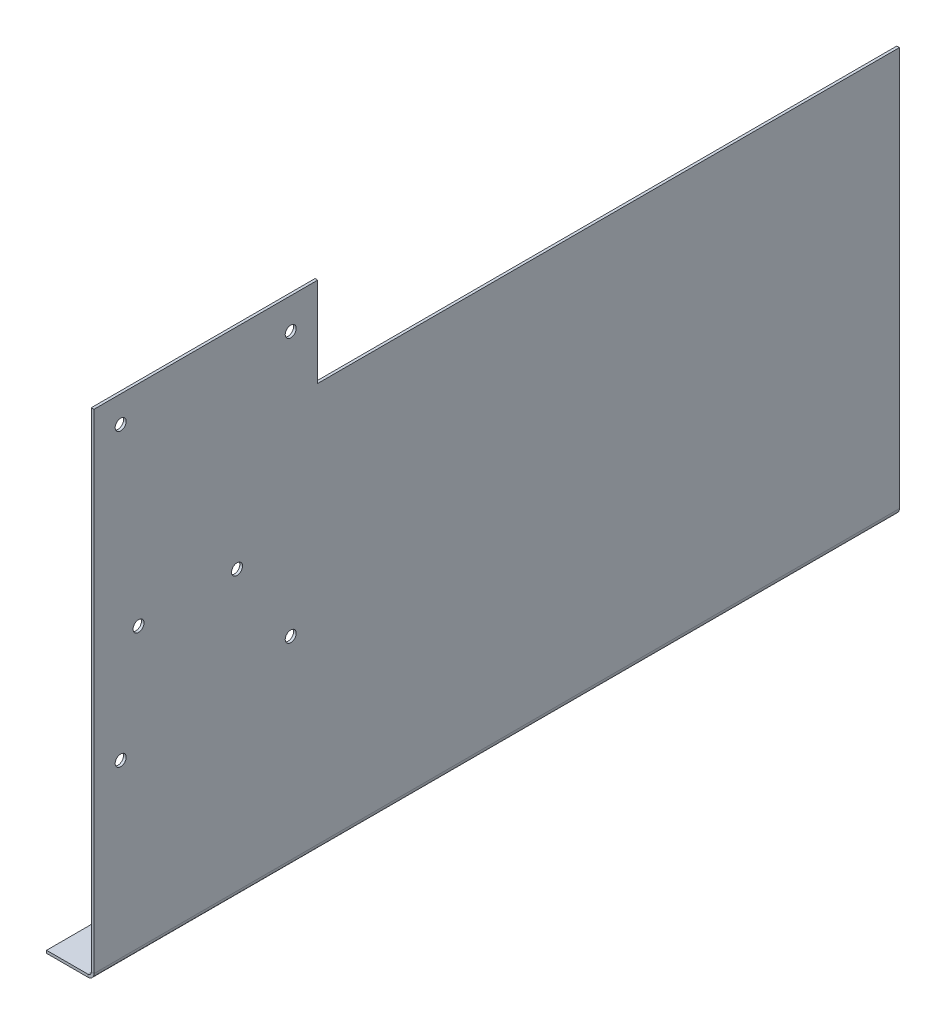
ISO-10303-21;
HEADER;
FILE_DESCRIPTION(('STEP AP214'),'2;1');
FILE_NAME('part.step','',(''),(''),'','','');
FILE_SCHEMA(('AUTOMOTIVE_DESIGN { 1 0 10303 214 1 1 1 1 }'));
ENDSEC;
DATA;
#1=APPLICATION_CONTEXT('core data for automotive mechanical design processes');
#2=APPLICATION_PROTOCOL_DEFINITION('international standard','automotive_design',2000,#1);
#3=PRODUCT_CONTEXT('',#1,'mechanical');
#4=PRODUCT('Part','Part','',(#3));
#5=PRODUCT_RELATED_PRODUCT_CATEGORY('part','',(#4));
#6=PRODUCT_DEFINITION_FORMATION('','',#4);
#7=PRODUCT_DEFINITION_CONTEXT('part definition',#1,'design');
#8=PRODUCT_DEFINITION('design','',#6,#7);
#9=PRODUCT_DEFINITION_SHAPE('','',#8);
#10=(LENGTH_UNIT() NAMED_UNIT(*) SI_UNIT(.MILLI.,.METRE.));
#11=(NAMED_UNIT(*) PLANE_ANGLE_UNIT() SI_UNIT($,.RADIAN.));
#12=(NAMED_UNIT(*) SI_UNIT($,.STERADIAN.) SOLID_ANGLE_UNIT());
#13=UNCERTAINTY_MEASURE_WITH_UNIT(LENGTH_MEASURE(1.E-05),#10,'distance_accuracy_value','');
#14=(GEOMETRIC_REPRESENTATION_CONTEXT(3) GLOBAL_UNCERTAINTY_ASSIGNED_CONTEXT((#13)) GLOBAL_UNIT_ASSIGNED_CONTEXT((#10,
#11,#12)) REPRESENTATION_CONTEXT('',''));
#15=CARTESIAN_POINT('',(0.,0.,0.));
#16=DIRECTION('',(0.,0.,1.));
#17=DIRECTION('',(1.,0.,0.));
#18=AXIS2_PLACEMENT_3D('',#15,#16,#17);
#19=CARTESIAN_POINT('',(12.7,1.,228.6));
#20=DIRECTION('',(0.,0.,1.));
#21=DIRECTION('',(1.,0.,0.));
#22=AXIS2_PLACEMENT_3D('',#19,#20,#21);
#23=PLANE('',#22);
#24=DIRECTION('',(1.,0.,0.));
#25=VECTOR('',#24,1.);
#26=CARTESIAN_POINT('',(12.7,1.,228.6));
#27=LINE('',#26,#25);
#28=CARTESIAN_POINT('',(12.7,1.,228.6));
#29=VERTEX_POINT('',#28);
#30=CARTESIAN_POINT('',(13.45946,1.,228.6));
#31=VERTEX_POINT('',#30);
#32=EDGE_CURVE('E11',#29,#31,#27,.T.);
#33=ORIENTED_EDGE('',*,*,#32,.F.);
#34=CARTESIAN_POINT('',(11.7,1.,228.6));
#35=DIRECTION('',(0.,0.,-1.));
#36=DIRECTION('',(-1.,0.,0.));
#37=AXIS2_PLACEMENT_3D('',#34,#35,#36);
#38=CIRCLE('',#37,1.);
#39=CARTESIAN_POINT('',(11.7,0.,228.6));
#40=VERTEX_POINT('',#39);
#41=EDGE_CURVE('E136',#40,#29,#38,.F.);
#42=ORIENTED_EDGE('',*,*,#41,.F.);
#43=DIRECTION('',(0.,1.,0.));
#44=VECTOR('',#43,1.);
#45=CARTESIAN_POINT('',(11.7,-0.75946,228.6));
#46=LINE('',#45,#44);
#47=CARTESIAN_POINT('',(11.7,-0.75946,228.6));
#48=VERTEX_POINT('',#47);
#49=EDGE_CURVE('E42',#48,#40,#46,.T.);
#50=ORIENTED_EDGE('',*,*,#49,.F.);
#51=CARTESIAN_POINT('',(11.7,1.,228.6));
#52=DIRECTION('',(0.,0.,1.));
#53=DIRECTION('',(1.,0.,0.));
#54=AXIS2_PLACEMENT_3D('',#51,#52,#53);
#55=CIRCLE('',#54,1.75946);
#56=EDGE_CURVE('E129',#48,#31,#55,.T.);
#57=ORIENTED_EDGE('',*,*,#56,.T.);
#58=EDGE_LOOP('',(#33,#42,#50,#57));
#59=FACE_BOUND('',#58,.T.);
#60=ADVANCED_FACE('F34',(#59),#23,.T.);
#61=CARTESIAN_POINT('',(11.7,-0.75946,228.6));
#62=DIRECTION('',(0.,0.,1.));
#63=DIRECTION('',(1.,0.,0.));
#64=AXIS2_PLACEMENT_3D('',#61,#62,#63);
#65=PLANE('',#64);
#66=DIRECTION('',(0.,1.,0.));
#67=VECTOR('',#66,1.);
#68=CARTESIAN_POINT('',(12.7,0.,228.6));
#69=LINE('',#68,#67);
#70=CARTESIAN_POINT('',(12.7,139.7,228.6));
#71=VERTEX_POINT('',#70);
#72=EDGE_CURVE('E247',#29,#71,#69,.T.);
#73=ORIENTED_EDGE('',*,*,#72,.F.);
#74=ORIENTED_EDGE('',*,*,#32,.T.);
#75=DIRECTION('',(0.,1.,0.));
#76=VECTOR('',#75,1.);
#77=CARTESIAN_POINT('',(13.45946,0.,228.6));
#78=LINE('',#77,#76);
#79=CARTESIAN_POINT('',(13.45946,139.7,228.6));
#80=VERTEX_POINT('',#79);
#81=EDGE_CURVE('E91',#31,#80,#78,.T.);
#82=ORIENTED_EDGE('',*,*,#81,.T.);
#83=DIRECTION('',(1.,0.,0.));
#84=VECTOR('',#83,1.);
#85=CARTESIAN_POINT('',(12.7,139.7,228.6));
#86=LINE('',#85,#84);
#87=EDGE_CURVE('E244',#71,#80,#86,.T.);
#88=ORIENTED_EDGE('',*,*,#87,.F.);
#89=EDGE_LOOP('',(#73,#74,#82,#88));
#90=FACE_BOUND('',#89,.T.);
#91=ADVANCED_FACE('F268',(#90),#65,.T.);
#92=CARTESIAN_POINT('',(11.7,0.,0.));
#93=DIRECTION('',(0.,0.,-1.));
#94=DIRECTION('',(-1.,0.,0.));
#95=AXIS2_PLACEMENT_3D('',#92,#93,#94);
#96=PLANE('',#95);
#97=DIRECTION('',(0.,-1.,0.));
#98=VECTOR('',#97,1.);
#99=CARTESIAN_POINT('',(11.7,0.,0.));
#100=LINE('',#99,#98);
#101=CARTESIAN_POINT('',(11.7,0.,0.));
#102=VERTEX_POINT('',#101);
#103=CARTESIAN_POINT('',(11.7,-0.75946,0.));
#104=VERTEX_POINT('',#103);
#105=EDGE_CURVE('E176',#102,#104,#100,.T.);
#106=ORIENTED_EDGE('',*,*,#105,.F.);
#107=CARTESIAN_POINT('',(11.7,1.,0.));
#108=DIRECTION('',(0.,0.,-1.));
#109=DIRECTION('',(-1.,0.,0.));
#110=AXIS2_PLACEMENT_3D('',#107,#108,#109);
#111=CIRCLE('',#110,1.);
#112=CARTESIAN_POINT('',(12.7,1.,0.));
#113=VERTEX_POINT('',#112);
#114=EDGE_CURVE('E149',#102,#113,#111,.F.);
#115=ORIENTED_EDGE('',*,*,#114,.T.);
#116=DIRECTION('',(-1.,0.,0.));
#117=VECTOR('',#116,1.);
#118=CARTESIAN_POINT('',(13.45946,1.,0.));
#119=LINE('',#118,#117);
#120=CARTESIAN_POINT('',(13.45946,1.,0.));
#121=VERTEX_POINT('',#120);
#122=EDGE_CURVE('E85',#121,#113,#119,.T.);
#123=ORIENTED_EDGE('',*,*,#122,.F.);
#124=CARTESIAN_POINT('',(11.7,1.,0.));
#125=DIRECTION('',(0.,0.,1.));
#126=DIRECTION('',(1.,0.,0.));
#127=AXIS2_PLACEMENT_3D('',#124,#125,#126);
#128=CIRCLE('',#127,1.75946);
#129=EDGE_CURVE('E157',#104,#121,#128,.T.);
#130=ORIENTED_EDGE('',*,*,#129,.F.);
#131=EDGE_LOOP('',(#106,#115,#123,#130));
#132=FACE_BOUND('',#131,.T.);
#133=ADVANCED_FACE('F266',(#132),#96,.T.);
#134=CARTESIAN_POINT('',(13.45946,1.,0.));
#135=DIRECTION('',(0.,0.,-1.));
#136=DIRECTION('',(-1.,0.,0.));
#137=AXIS2_PLACEMENT_3D('',#134,#135,#136);
#138=PLANE('',#137);
#139=DIRECTION('',(1.,0.,0.));
#140=VECTOR('',#139,1.);
#141=CARTESIAN_POINT('',(0.,0.,0.));
#142=LINE('',#141,#140);
#143=CARTESIAN_POINT('',(0.,0.,0.));
#144=VERTEX_POINT('',#143);
#145=EDGE_CURVE('E151',#144,#102,#142,.T.);
#146=ORIENTED_EDGE('',*,*,#145,.T.);
#147=ORIENTED_EDGE('',*,*,#105,.T.);
#148=DIRECTION('',(1.,0.,0.));
#149=VECTOR('',#148,1.);
#150=CARTESIAN_POINT('',(0.,-0.75946,0.));
#151=LINE('',#150,#149);
#152=CARTESIAN_POINT('',(0.,-0.75946,0.));
#153=VERTEX_POINT('',#152);
#154=EDGE_CURVE('E155',#153,#104,#151,.T.);
#155=ORIENTED_EDGE('',*,*,#154,.F.);
#156=DIRECTION('',(0.,1.,0.));
#157=VECTOR('',#156,1.);
#158=CARTESIAN_POINT('',(0.,-0.75946,0.));
#159=LINE('',#158,#157);
#160=EDGE_CURVE('E115',#153,#144,#159,.T.);
#161=ORIENTED_EDGE('',*,*,#160,.T.);
#162=EDGE_LOOP('',(#146,#147,#155,#161));
#163=FACE_BOUND('',#162,.T.);
#164=ADVANCED_FACE('F262',(#163),#138,.T.);
#165=CARTESIAN_POINT('',(13.45946,0.,228.6));
#166=DIRECTION('',(-1.,0.,0.));
#167=DIRECTION('',(0.,0.,1.));
#168=AXIS2_PLACEMENT_3D('',#165,#166,#167);
#169=PLANE('',#168);
#170=CARTESIAN_POINT('',(13.45946,130.89814,172.7581));
#171=DIRECTION('',(1.,0.,0.));
#172=DIRECTION('',(0.,0.,-1.));
#173=AXIS2_PLACEMENT_3D('',#170,#171,#172);
#174=CIRCLE('',#173,1.56209999999981);
#175=CARTESIAN_POINT('',(13.45946,130.89814,171.196));
#176=VERTEX_POINT('',#175);
#177=EDGE_CURVE('E207',#176,#176,#174,.T.);
#178=ORIENTED_EDGE('',*,*,#177,.F.);
#179=EDGE_LOOP('',(#178));
#180=FACE_BOUND('',#179,.T.);
#181=CARTESIAN_POINT('',(13.45946,132.16814,221.0181));
#182=DIRECTION('',(1.,0.,0.));
#183=DIRECTION('',(0.,0.,-1.));
#184=AXIS2_PLACEMENT_3D('',#181,#182,#183);
#185=CIRCLE('',#184,1.56210000000001);
#186=CARTESIAN_POINT('',(13.45946,132.16814,219.456));
#187=VERTEX_POINT('',#186);
#188=EDGE_CURVE('E197',#187,#187,#185,.T.);
#189=ORIENTED_EDGE('',*,*,#188,.F.);
#190=EDGE_LOOP('',(#189));
#191=FACE_BOUND('',#190,.T.);
#192=CARTESIAN_POINT('',(13.45946,80.09814,187.9981));
#193=DIRECTION('',(1.,0.,0.));
#194=DIRECTION('',(0.,0.,-1.));
#195=AXIS2_PLACEMENT_3D('',#192,#193,#194);
#196=CIRCLE('',#195,1.56209999999998);
#197=CARTESIAN_POINT('',(13.45946,80.09814,186.436));
#198=VERTEX_POINT('',#197);
#199=EDGE_CURVE('E194',#198,#198,#196,.T.);
#200=ORIENTED_EDGE('',*,*,#199,.F.);
#201=EDGE_LOOP('',(#200));
#202=FACE_BOUND('',#201,.T.);
#203=CARTESIAN_POINT('',(13.45946,80.09814,215.9381));
#204=DIRECTION('',(1.,0.,0.));
#205=DIRECTION('',(0.,0.,-1.));
#206=AXIS2_PLACEMENT_3D('',#203,#204,#205);
#207=CIRCLE('',#206,1.56210000000001);
#208=CARTESIAN_POINT('',(13.45946,80.09814,214.376));
#209=VERTEX_POINT('',#208);
#210=EDGE_CURVE('E191',#209,#209,#207,.T.);
#211=ORIENTED_EDGE('',*,*,#210,.F.);
#212=EDGE_LOOP('',(#211));
#213=FACE_BOUND('',#212,.T.);
#214=CARTESIAN_POINT('',(13.45946,55.96814,172.7581));
#215=DIRECTION('',(1.,0.,0.));
#216=DIRECTION('',(0.,0.,-1.));
#217=AXIS2_PLACEMENT_3D('',#214,#215,#216);
#218=CIRCLE('',#217,1.56210000000001);
#219=CARTESIAN_POINT('',(13.45946,55.96814,171.196));
#220=VERTEX_POINT('',#219);
#221=EDGE_CURVE('E187',#220,#220,#218,.T.);
#222=ORIENTED_EDGE('',*,*,#221,.F.);
#223=EDGE_LOOP('',(#222));
#224=FACE_BOUND('',#223,.T.);
#225=CARTESIAN_POINT('',(13.45946,49.61814,221.0181));
#226=DIRECTION('',(1.,0.,0.));
#227=DIRECTION('',(0.,0.,-1.));
#228=AXIS2_PLACEMENT_3D('',#225,#226,#227);
#229=CIRCLE('',#228,1.56210000000001);
#230=CARTESIAN_POINT('',(13.45946,49.61814,219.456));
#231=VERTEX_POINT('',#230);
#232=EDGE_CURVE('E183',#231,#231,#229,.T.);
#233=ORIENTED_EDGE('',*,*,#232,.F.);
#234=EDGE_LOOP('',(#233));
#235=FACE_BOUND('',#234,.T.);
#236=DIRECTION('',(0.,1.,0.));
#237=VECTOR('',#236,1.);
#238=CARTESIAN_POINT('',(13.45946,0.,0.));
#239=LINE('',#238,#237);
#240=CARTESIAN_POINT('',(13.45946,114.3,0.));
#241=VERTEX_POINT('',#240);
#242=EDGE_CURVE('E142',#121,#241,#239,.T.);
#243=ORIENTED_EDGE('',*,*,#242,.T.);
#244=DIRECTION('',(0.,0.,-1.));
#245=VECTOR('',#244,1.);
#246=CARTESIAN_POINT('',(13.45946,114.3,0.));
#247=LINE('',#246,#245);
#248=CARTESIAN_POINT('',(13.45946,114.3,165.1));
#249=VERTEX_POINT('',#248);
#250=EDGE_CURVE('E50',#249,#241,#247,.T.);
#251=ORIENTED_EDGE('',*,*,#250,.F.);
#252=DIRECTION('',(0.,-1.,0.));
#253=VECTOR('',#252,1.);
#254=CARTESIAN_POINT('',(13.45946,139.7,165.1));
#255=LINE('',#254,#253);
#256=CARTESIAN_POINT('',(13.45946,139.7,165.1));
#257=VERTEX_POINT('',#256);
#258=EDGE_CURVE('E233',#257,#249,#255,.T.);
#259=ORIENTED_EDGE('',*,*,#258,.F.);
#260=DIRECTION('',(0.,0.,-1.));
#261=VECTOR('',#260,1.);
#262=CARTESIAN_POINT('',(13.45946,139.7,228.6));
#263=LINE('',#262,#261);
#264=EDGE_CURVE('E172',#80,#257,#263,.T.);
#265=ORIENTED_EDGE('',*,*,#264,.F.);
#266=ORIENTED_EDGE('',*,*,#81,.F.);
#267=DIRECTION('',(0.,0.,-1.));
#268=VECTOR('',#267,1.);
#269=CARTESIAN_POINT('',(13.45946,1.,228.6));
#270=LINE('',#269,#268);
#271=EDGE_CURVE('E141',#31,#121,#270,.T.);
#272=ORIENTED_EDGE('',*,*,#271,.T.);
#273=EDGE_LOOP('',(#243,#251,#259,#265,#266,#272));
#274=FACE_BOUND('',#273,.T.);
#275=ADVANCED_FACE('F274',(#180,#191,#202,#213,#224,#235,#274),#169,.F.);
#276=CARTESIAN_POINT('',(12.7,139.7,228.6));
#277=DIRECTION('',(0.,1.,0.));
#278=DIRECTION('',(0.,0.,1.));
#279=AXIS2_PLACEMENT_3D('',#276,#277,#278);
#280=PLANE('',#279);
#281=DIRECTION('',(1.,0.,0.));
#282=VECTOR('',#281,1.);
#283=CARTESIAN_POINT('',(-0.000999999999999265,139.7,165.1));
#284=LINE('',#283,#282);
#285=CARTESIAN_POINT('',(12.7,139.7,165.1));
#286=VERTEX_POINT('',#285);
#287=EDGE_CURVE('E237',#286,#257,#284,.T.);
#288=ORIENTED_EDGE('',*,*,#287,.F.);
#289=DIRECTION('',(0.,0.,-1.));
#290=VECTOR('',#289,1.);
#291=CARTESIAN_POINT('',(12.7,139.7,228.6));
#292=LINE('',#291,#290);
#293=EDGE_CURVE('E169',#71,#286,#292,.T.);
#294=ORIENTED_EDGE('',*,*,#293,.F.);
#295=ORIENTED_EDGE('',*,*,#87,.T.);
#296=ORIENTED_EDGE('',*,*,#264,.T.);
#297=EDGE_LOOP('',(#288,#294,#295,#296));
#298=FACE_BOUND('',#297,.T.);
#299=ADVANCED_FACE('F349',(#298),#280,.T.);
#300=CARTESIAN_POINT('',(12.7,0.,228.6));
#301=DIRECTION('',(-1.,0.,0.));
#302=DIRECTION('',(0.,0.,1.));
#303=AXIS2_PLACEMENT_3D('',#300,#301,#302);
#304=PLANE('',#303);
#305=CARTESIAN_POINT('',(12.7,130.89814,172.7581));
#306=DIRECTION('',(-1.,0.,0.));
#307=DIRECTION('',(0.,0.,1.));
#308=AXIS2_PLACEMENT_3D('',#305,#306,#307);
#309=CIRCLE('',#308,1.56209999999981);
#310=CARTESIAN_POINT('',(12.7,130.89814,174.3202));
#311=VERTEX_POINT('',#310);
#312=EDGE_CURVE('E37',#311,#311,#309,.T.);
#313=ORIENTED_EDGE('',*,*,#312,.F.);
#314=EDGE_LOOP('',(#313));
#315=FACE_BOUND('',#314,.T.);
#316=CARTESIAN_POINT('',(12.7,132.16814,221.0181));
#317=DIRECTION('',(-1.,0.,0.));
#318=DIRECTION('',(0.,0.,1.));
#319=AXIS2_PLACEMENT_3D('',#316,#317,#318);
#320=CIRCLE('',#319,1.56210000000001);
#321=CARTESIAN_POINT('',(12.7,132.16814,222.5802));
#322=VERTEX_POINT('',#321);
#323=EDGE_CURVE('E195',#322,#322,#320,.T.);
#324=ORIENTED_EDGE('',*,*,#323,.F.);
#325=EDGE_LOOP('',(#324));
#326=FACE_BOUND('',#325,.T.);
#327=CARTESIAN_POINT('',(12.7,80.09814,187.9981));
#328=DIRECTION('',(-1.,0.,0.));
#329=DIRECTION('',(0.,0.,1.));
#330=AXIS2_PLACEMENT_3D('',#327,#328,#329);
#331=CIRCLE('',#330,1.56209999999998);
#332=CARTESIAN_POINT('',(12.7,80.09814,189.5602));
#333=VERTEX_POINT('',#332);
#334=EDGE_CURVE('E192',#333,#333,#331,.T.);
#335=ORIENTED_EDGE('',*,*,#334,.F.);
#336=EDGE_LOOP('',(#335));
#337=FACE_BOUND('',#336,.T.);
#338=CARTESIAN_POINT('',(12.7,80.09814,215.9381));
#339=DIRECTION('',(-1.,0.,0.));
#340=DIRECTION('',(0.,0.,1.));
#341=AXIS2_PLACEMENT_3D('',#338,#339,#340);
#342=CIRCLE('',#341,1.56210000000001);
#343=CARTESIAN_POINT('',(12.7,80.09814,217.5002));
#344=VERTEX_POINT('',#343);
#345=EDGE_CURVE('E188',#344,#344,#342,.T.);
#346=ORIENTED_EDGE('',*,*,#345,.F.);
#347=EDGE_LOOP('',(#346));
#348=FACE_BOUND('',#347,.T.);
#349=CARTESIAN_POINT('',(12.7,55.96814,172.7581));
#350=DIRECTION('',(-1.,0.,0.));
#351=DIRECTION('',(0.,0.,1.));
#352=AXIS2_PLACEMENT_3D('',#349,#350,#351);
#353=CIRCLE('',#352,1.56210000000001);
#354=CARTESIAN_POINT('',(12.7,55.96814,174.3202));
#355=VERTEX_POINT('',#354);
#356=EDGE_CURVE('E184',#355,#355,#353,.T.);
#357=ORIENTED_EDGE('',*,*,#356,.F.);
#358=EDGE_LOOP('',(#357));
#359=FACE_BOUND('',#358,.T.);
#360=CARTESIAN_POINT('',(12.7,49.61814,221.0181));
#361=DIRECTION('',(-1.,0.,0.));
#362=DIRECTION('',(0.,0.,1.));
#363=AXIS2_PLACEMENT_3D('',#360,#361,#362);
#364=CIRCLE('',#363,1.56210000000001);
#365=CARTESIAN_POINT('',(12.7,49.61814,222.5802));
#366=VERTEX_POINT('',#365);
#367=EDGE_CURVE('E179',#366,#366,#364,.T.);
#368=ORIENTED_EDGE('',*,*,#367,.F.);
#369=EDGE_LOOP('',(#368));
#370=FACE_BOUND('',#369,.T.);
#371=DIRECTION('',(0.,0.,-1.));
#372=VECTOR('',#371,1.);
#373=CARTESIAN_POINT('',(12.7,114.3,0.));
#374=LINE('',#373,#372);
#375=CARTESIAN_POINT('',(12.7,114.3,165.1));
#376=VERTEX_POINT('',#375);
#377=CARTESIAN_POINT('',(12.7,114.3,0.));
#378=VERTEX_POINT('',#377);
#379=EDGE_CURVE('E230',#376,#378,#374,.T.);
#380=ORIENTED_EDGE('',*,*,#379,.T.);
#381=DIRECTION('',(0.,1.,0.));
#382=VECTOR('',#381,1.);
#383=CARTESIAN_POINT('',(12.7,0.,0.));
#384=LINE('',#383,#382);
#385=EDGE_CURVE('E145',#113,#378,#384,.T.);
#386=ORIENTED_EDGE('',*,*,#385,.F.);
#387=DIRECTION('',(0.,0.,-1.));
#388=VECTOR('',#387,1.);
#389=CARTESIAN_POINT('',(12.7,1.,228.6));
#390=LINE('',#389,#388);
#391=EDGE_CURVE('E166',#29,#113,#390,.T.);
#392=ORIENTED_EDGE('',*,*,#391,.F.);
#393=ORIENTED_EDGE('',*,*,#72,.T.);
#394=ORIENTED_EDGE('',*,*,#293,.T.);
#395=DIRECTION('',(0.,-1.,0.));
#396=VECTOR('',#395,1.);
#397=CARTESIAN_POINT('',(12.7,139.7,165.1));
#398=LINE('',#397,#396);
#399=EDGE_CURVE('E227',#286,#376,#398,.T.);
#400=ORIENTED_EDGE('',*,*,#399,.T.);
#401=EDGE_LOOP('',(#380,#386,#392,#393,#394,#400));
#402=FACE_BOUND('',#401,.T.);
#403=ADVANCED_FACE('F307',(#315,#326,#337,#348,#359,#370,#402),#304,.T.);
#404=CARTESIAN_POINT('',(11.7,1.,228.6));
#405=DIRECTION('',(0.,0.,-1.));
#406=DIRECTION('',(-1.,0.,0.));
#407=AXIS2_PLACEMENT_3D('',#404,#405,#406);
#408=CYLINDRICAL_SURFACE('',#407,1.);
#409=ORIENTED_EDGE('',*,*,#114,.F.);
#410=DIRECTION('',(0.,0.,-1.));
#411=VECTOR('',#410,1.);
#412=CARTESIAN_POINT('',(11.7,0.,228.6));
#413=LINE('',#412,#411);
#414=EDGE_CURVE('E163',#40,#102,#413,.T.);
#415=ORIENTED_EDGE('',*,*,#414,.F.);
#416=ORIENTED_EDGE('',*,*,#41,.T.);
#417=ORIENTED_EDGE('',*,*,#391,.T.);
#418=EDGE_LOOP('',(#409,#415,#416,#417));
#419=FACE_BOUND('',#418,.T.);
#420=ADVANCED_FACE('F254',(#419),#408,.F.);
#421=CARTESIAN_POINT('',(0.,0.,228.6));
#422=DIRECTION('',(0.,1.,0.));
#423=DIRECTION('',(0.,0.,1.));
#424=AXIS2_PLACEMENT_3D('',#421,#422,#423);
#425=PLANE('',#424);
#426=CARTESIAN_POINT('',(6.34999999999999,0.,215.9));
#427=DIRECTION('',(0.,1.,0.));
#428=DIRECTION('',(0.,0.,1.));
#429=AXIS2_PLACEMENT_3D('',#426,#427,#428);
#430=CIRCLE('',#429,2.);
#431=CARTESIAN_POINT('',(6.34999999999999,0.,217.9));
#432=VERTEX_POINT('',#431);
#433=EDGE_CURVE('E182',#432,#432,#430,.T.);
#434=ORIENTED_EDGE('',*,*,#433,.F.);
#435=EDGE_LOOP('',(#434));
#436=FACE_BOUND('',#435,.T.);
#437=CARTESIAN_POINT('',(6.34999999999999,0.,12.7));
#438=DIRECTION('',(0.,1.,0.));
#439=DIRECTION('',(0.,0.,1.));
#440=AXIS2_PLACEMENT_3D('',#437,#438,#439);
#441=CIRCLE('',#440,2.);
#442=CARTESIAN_POINT('',(6.34999999999999,0.,14.7));
#443=VERTEX_POINT('',#442);
#444=EDGE_CURVE('E221',#443,#443,#441,.T.);
#445=ORIENTED_EDGE('',*,*,#444,.F.);
#446=EDGE_LOOP('',(#445));
#447=FACE_BOUND('',#446,.T.);
#448=ORIENTED_EDGE('',*,*,#145,.F.);
#449=DIRECTION('',(0.,0.,-1.));
#450=VECTOR('',#449,1.);
#451=CARTESIAN_POINT('',(0.,0.,228.6));
#452=LINE('',#451,#450);
#453=CARTESIAN_POINT('',(0.,0.,228.6));
#454=VERTEX_POINT('',#453);
#455=EDGE_CURVE('E119',#454,#144,#452,.T.);
#456=ORIENTED_EDGE('',*,*,#455,.F.);
#457=DIRECTION('',(1.,0.,0.));
#458=VECTOR('',#457,1.);
#459=CARTESIAN_POINT('',(0.,0.,228.6));
#460=LINE('',#459,#458);
#461=EDGE_CURVE('E134',#454,#40,#460,.T.);
#462=ORIENTED_EDGE('',*,*,#461,.T.);
#463=ORIENTED_EDGE('',*,*,#414,.T.);
#464=EDGE_LOOP('',(#448,#456,#462,#463));
#465=FACE_BOUND('',#464,.T.);
#466=ADVANCED_FACE('F260',(#436,#447,#465),#425,.T.);
#467=CARTESIAN_POINT('',(0.,-0.75946,228.6));
#468=DIRECTION('',(-1.,0.,0.));
#469=DIRECTION('',(0.,0.,1.));
#470=AXIS2_PLACEMENT_3D('',#467,#468,#469);
#471=PLANE('',#470);
#472=ORIENTED_EDGE('',*,*,#160,.F.);
#473=DIRECTION('',(0.,0.,-1.));
#474=VECTOR('',#473,1.);
#475=CARTESIAN_POINT('',(0.,-0.75946,228.6));
#476=LINE('',#475,#474);
#477=CARTESIAN_POINT('',(0.,-0.75946,228.6));
#478=VERTEX_POINT('',#477);
#479=EDGE_CURVE('E109',#478,#153,#476,.T.);
#480=ORIENTED_EDGE('',*,*,#479,.F.);
#481=DIRECTION('',(0.,1.,0.));
#482=VECTOR('',#481,1.);
#483=CARTESIAN_POINT('',(0.,-0.75946,228.6));
#484=LINE('',#483,#482);
#485=EDGE_CURVE('E113',#478,#454,#484,.T.);
#486=ORIENTED_EDGE('',*,*,#485,.T.);
#487=ORIENTED_EDGE('',*,*,#455,.T.);
#488=EDGE_LOOP('',(#472,#480,#486,#487));
#489=FACE_BOUND('',#488,.T.);
#490=ADVANCED_FACE('F111',(#489),#471,.T.);
#491=CARTESIAN_POINT('',(0.,-0.75946,228.6));
#492=DIRECTION('',(0.,1.,0.));
#493=DIRECTION('',(0.,0.,1.));
#494=AXIS2_PLACEMENT_3D('',#491,#492,#493);
#495=PLANE('',#494);
#496=CARTESIAN_POINT('',(6.34999999999999,-0.75946,215.9));
#497=DIRECTION('',(0.,1.,0.));
#498=DIRECTION('',(0.,0.,1.));
#499=AXIS2_PLACEMENT_3D('',#496,#497,#498);
#500=CIRCLE('',#499,2.);
#501=CARTESIAN_POINT('',(6.34999999999999,-0.75946,217.9));
#502=VERTEX_POINT('',#501);
#503=EDGE_CURVE('E218',#502,#502,#500,.F.);
#504=ORIENTED_EDGE('',*,*,#503,.F.);
#505=EDGE_LOOP('',(#504));
#506=FACE_BOUND('',#505,.T.);
#507=CARTESIAN_POINT('',(6.34999999999999,-0.75946,12.7));
#508=DIRECTION('',(0.,1.,0.));
#509=DIRECTION('',(0.,0.,1.));
#510=AXIS2_PLACEMENT_3D('',#507,#508,#509);
#511=CIRCLE('',#510,2.);
#512=CARTESIAN_POINT('',(6.34999999999999,-0.75946,14.7));
#513=VERTEX_POINT('',#512);
#514=EDGE_CURVE('E224',#513,#513,#511,.F.);
#515=ORIENTED_EDGE('',*,*,#514,.F.);
#516=EDGE_LOOP('',(#515));
#517=FACE_BOUND('',#516,.T.);
#518=ORIENTED_EDGE('',*,*,#154,.T.);
#519=DIRECTION('',(0.,0.,-1.));
#520=VECTOR('',#519,1.);
#521=CARTESIAN_POINT('',(11.7,-0.75946,228.6));
#522=LINE('',#521,#520);
#523=EDGE_CURVE('E120',#48,#104,#522,.T.);
#524=ORIENTED_EDGE('',*,*,#523,.F.);
#525=DIRECTION('',(1.,0.,0.));
#526=VECTOR('',#525,1.);
#527=CARTESIAN_POINT('',(0.,-0.75946,228.6));
#528=LINE('',#527,#526);
#529=EDGE_CURVE('E124',#478,#48,#528,.T.);
#530=ORIENTED_EDGE('',*,*,#529,.F.);
#531=ORIENTED_EDGE('',*,*,#479,.T.);
#532=EDGE_LOOP('',(#518,#524,#530,#531));
#533=FACE_BOUND('',#532,.T.);
#534=ADVANCED_FACE('F125',(#506,#517,#533),#495,.F.);
#535=CARTESIAN_POINT('',(11.7,1.,228.6));
#536=DIRECTION('',(0.,0.,-1.));
#537=DIRECTION('',(-1.,0.,0.));
#538=AXIS2_PLACEMENT_3D('',#535,#536,#537);
#539=CYLINDRICAL_SURFACE('',#538,1.75946);
#540=ORIENTED_EDGE('',*,*,#129,.T.);
#541=ORIENTED_EDGE('',*,*,#271,.F.);
#542=ORIENTED_EDGE('',*,*,#56,.F.);
#543=ORIENTED_EDGE('',*,*,#523,.T.);
#544=EDGE_LOOP('',(#540,#541,#542,#543));
#545=FACE_BOUND('',#544,.T.);
#546=ADVANCED_FACE('F264',(#545),#539,.T.);
#547=CARTESIAN_POINT('',(11.7,1.,228.6));
#548=DIRECTION('',(0.,0.,-1.));
#549=DIRECTION('',(-1.,0.,0.));
#550=AXIS2_PLACEMENT_3D('',#547,#548,#549);
#551=PLANE('',#550);
#552=ORIENTED_EDGE('',*,*,#529,.T.);
#553=ORIENTED_EDGE('',*,*,#49,.T.);
#554=ORIENTED_EDGE('',*,*,#461,.F.);
#555=ORIENTED_EDGE('',*,*,#485,.F.);
#556=EDGE_LOOP('',(#552,#553,#554,#555));
#557=FACE_BOUND('',#556,.T.);
#558=ADVANCED_FACE('F132',(#557),#551,.F.);
#559=CARTESIAN_POINT('',(11.7,1.,0.));
#560=DIRECTION('',(0.,0.,-1.));
#561=DIRECTION('',(-1.,0.,0.));
#562=AXIS2_PLACEMENT_3D('',#559,#560,#561);
#563=PLANE('',#562);
#564=DIRECTION('',(1.,0.,0.));
#565=VECTOR('',#564,1.);
#566=CARTESIAN_POINT('',(-0.000999999999999265,114.3,0.));
#567=LINE('',#566,#565);
#568=EDGE_CURVE('E146',#378,#241,#567,.T.);
#569=ORIENTED_EDGE('',*,*,#568,.T.);
#570=ORIENTED_EDGE('',*,*,#242,.F.);
#571=ORIENTED_EDGE('',*,*,#122,.T.);
#572=ORIENTED_EDGE('',*,*,#385,.T.);
#573=EDGE_LOOP('',(#569,#570,#571,#572));
#574=FACE_BOUND('',#573,.T.);
#575=ADVANCED_FACE('F341',(#574),#563,.T.);
#576=CARTESIAN_POINT('',(-0.000999999999999265,114.3,0.));
#577=DIRECTION('',(0.,-1.,0.));
#578=DIRECTION('',(0.,0.,-1.));
#579=AXIS2_PLACEMENT_3D('',#576,#577,#578);
#580=PLANE('',#579);
#581=DIRECTION('',(1.,0.,0.));
#582=VECTOR('',#581,1.);
#583=CARTESIAN_POINT('',(-0.000999999999999265,114.3,165.1));
#584=LINE('',#583,#582);
#585=EDGE_CURVE('E239',#376,#249,#584,.T.);
#586=ORIENTED_EDGE('',*,*,#585,.T.);
#587=ORIENTED_EDGE('',*,*,#250,.T.);
#588=ORIENTED_EDGE('',*,*,#568,.F.);
#589=ORIENTED_EDGE('',*,*,#379,.F.);
#590=EDGE_LOOP('',(#586,#587,#588,#589));
#591=FACE_BOUND('',#590,.T.);
#592=ADVANCED_FACE('F362',(#591),#580,.F.);
#593=CARTESIAN_POINT('',(-0.000999999999999265,139.7,165.1));
#594=DIRECTION('',(0.,0.,1.));
#595=DIRECTION('',(0.,-1.,0.));
#596=AXIS2_PLACEMENT_3D('',#593,#594,#595);
#597=PLANE('',#596);
#598=ORIENTED_EDGE('',*,*,#287,.T.);
#599=ORIENTED_EDGE('',*,*,#258,.T.);
#600=ORIENTED_EDGE('',*,*,#585,.F.);
#601=ORIENTED_EDGE('',*,*,#399,.F.);
#602=EDGE_LOOP('',(#598,#599,#600,#601));
#603=FACE_BOUND('',#602,.T.);
#604=ADVANCED_FACE('F373',(#603),#597,.F.);
#605=CARTESIAN_POINT('',(6.34999999999999,-0.76046,12.7));
#606=DIRECTION('',(0.,1.,0.));
#607=DIRECTION('',(0.,0.,1.));
#608=AXIS2_PLACEMENT_3D('',#605,#606,#607);
#609=CYLINDRICAL_SURFACE('',#608,2.);
#610=ORIENTED_EDGE('',*,*,#444,.T.);
#611=EDGE_LOOP('',(#610));
#612=FACE_BOUND('',#611,.T.);
#613=ORIENTED_EDGE('',*,*,#514,.T.);
#614=EDGE_LOOP('',(#613));
#615=FACE_BOUND('',#614,.T.);
#616=ADVANCED_FACE('F383',(#612,#615),#609,.F.);
#617=CARTESIAN_POINT('',(6.34999999999999,-0.76046,215.9));
#618=DIRECTION('',(0.,1.,0.));
#619=DIRECTION('',(0.,0.,1.));
#620=AXIS2_PLACEMENT_3D('',#617,#618,#619);
#621=CYLINDRICAL_SURFACE('',#620,2.);
#622=ORIENTED_EDGE('',*,*,#433,.T.);
#623=EDGE_LOOP('',(#622));
#624=FACE_BOUND('',#623,.T.);
#625=ORIENTED_EDGE('',*,*,#503,.T.);
#626=EDGE_LOOP('',(#625));
#627=FACE_BOUND('',#626,.T.);
#628=ADVANCED_FACE('F410',(#624,#627),#621,.F.);
#629=CARTESIAN_POINT('',(0.,49.61814,221.0181));
#630=DIRECTION('',(1.,0.,0.));
#631=DIRECTION('',(0.,0.,-1.));
#632=AXIS2_PLACEMENT_3D('',#629,#630,#631);
#633=CYLINDRICAL_SURFACE('',#632,1.56210000000001);
#634=ORIENTED_EDGE('',*,*,#367,.T.);
#635=EDGE_LOOP('',(#634));
#636=FACE_BOUND('',#635,.T.);
#637=ORIENTED_EDGE('',*,*,#232,.T.);
#638=EDGE_LOOP('',(#637));
#639=FACE_BOUND('',#638,.T.);
#640=ADVANCED_FACE('F421',(#636,#639),#633,.F.);
#641=CARTESIAN_POINT('',(0.,55.96814,172.7581));
#642=DIRECTION('',(1.,0.,0.));
#643=DIRECTION('',(0.,0.,-1.));
#644=AXIS2_PLACEMENT_3D('',#641,#642,#643);
#645=CYLINDRICAL_SURFACE('',#644,1.56210000000001);
#646=ORIENTED_EDGE('',*,*,#356,.T.);
#647=EDGE_LOOP('',(#646));
#648=FACE_BOUND('',#647,.T.);
#649=ORIENTED_EDGE('',*,*,#221,.T.);
#650=EDGE_LOOP('',(#649));
#651=FACE_BOUND('',#650,.T.);
#652=ADVANCED_FACE('F448',(#648,#651),#645,.F.);
#653=CARTESIAN_POINT('',(0.,80.09814,215.9381));
#654=DIRECTION('',(1.,0.,0.));
#655=DIRECTION('',(0.,0.,-1.));
#656=AXIS2_PLACEMENT_3D('',#653,#654,#655);
#657=CYLINDRICAL_SURFACE('',#656,1.56210000000001);
#658=ORIENTED_EDGE('',*,*,#345,.T.);
#659=EDGE_LOOP('',(#658));
#660=FACE_BOUND('',#659,.T.);
#661=ORIENTED_EDGE('',*,*,#210,.T.);
#662=EDGE_LOOP('',(#661));
#663=FACE_BOUND('',#662,.T.);
#664=ADVANCED_FACE('F459',(#660,#663),#657,.F.);
#665=CARTESIAN_POINT('',(0.,80.09814,187.9981));
#666=DIRECTION('',(1.,0.,0.));
#667=DIRECTION('',(0.,0.,-1.));
#668=AXIS2_PLACEMENT_3D('',#665,#666,#667);
#669=CYLINDRICAL_SURFACE('',#668,1.56209999999998);
#670=ORIENTED_EDGE('',*,*,#334,.T.);
#671=EDGE_LOOP('',(#670));
#672=FACE_BOUND('',#671,.T.);
#673=ORIENTED_EDGE('',*,*,#199,.T.);
#674=EDGE_LOOP('',(#673));
#675=FACE_BOUND('',#674,.T.);
#676=ADVANCED_FACE('F470',(#672,#675),#669,.F.);
#677=CARTESIAN_POINT('',(0.,132.16814,221.0181));
#678=DIRECTION('',(1.,0.,0.));
#679=DIRECTION('',(0.,0.,-1.));
#680=AXIS2_PLACEMENT_3D('',#677,#678,#679);
#681=CYLINDRICAL_SURFACE('',#680,1.56210000000001);
#682=ORIENTED_EDGE('',*,*,#323,.T.);
#683=EDGE_LOOP('',(#682));
#684=FACE_BOUND('',#683,.T.);
#685=ORIENTED_EDGE('',*,*,#188,.T.);
#686=EDGE_LOOP('',(#685));
#687=FACE_BOUND('',#686,.T.);
#688=ADVANCED_FACE('F481',(#684,#687),#681,.F.);
#689=CARTESIAN_POINT('',(0.,130.89814,172.7581));
#690=DIRECTION('',(1.,0.,0.));
#691=DIRECTION('',(0.,0.,-1.));
#692=AXIS2_PLACEMENT_3D('',#689,#690,#691);
#693=CYLINDRICAL_SURFACE('',#692,1.56209999999981);
#694=ORIENTED_EDGE('',*,*,#312,.T.);
#695=EDGE_LOOP('',(#694));
#696=FACE_BOUND('',#695,.T.);
#697=ORIENTED_EDGE('',*,*,#177,.T.);
#698=EDGE_LOOP('',(#697));
#699=FACE_BOUND('',#698,.T.);
#700=ADVANCED_FACE('F492',(#696,#699),#693,.F.);
#701=CLOSED_SHELL('',(#60,#91,#133,#164,#275,#299,#403,#420,#466,#490,#534,#546,#558,#575,#592,
#604,#616,#628,#640,#652,#664,#676,#688,#700));
#702=MANIFOLD_SOLID_BREP('B2',#701);
#703=ADVANCED_BREP_SHAPE_REPRESENTATION('',(#18,#702),#14);
#704=SHAPE_DEFINITION_REPRESENTATION(#9,#703);
ENDSEC;
END-ISO-10303-21;
